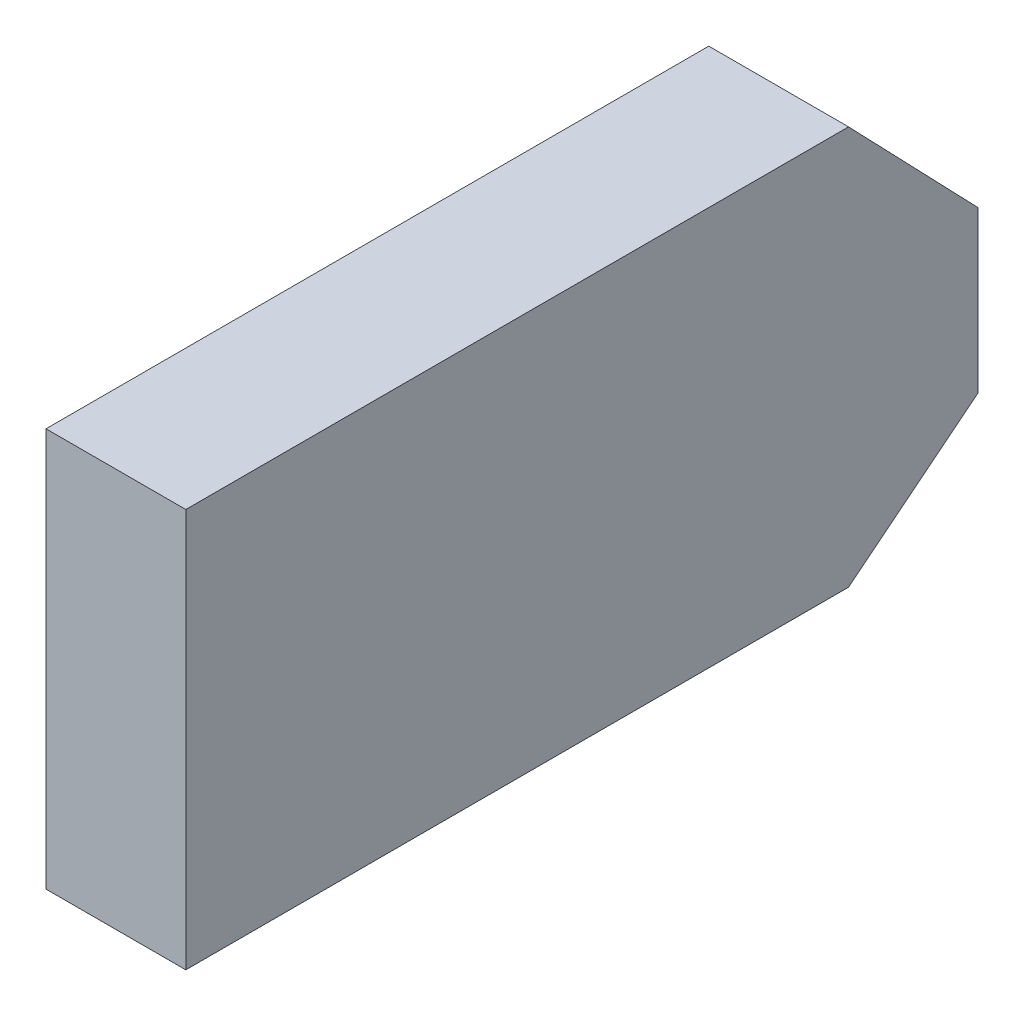
ISO-10303-21;
HEADER;
FILE_DESCRIPTION(('STEP AP214'),'2;1');
FILE_NAME('part.step','',(''),(''),'','','');
FILE_SCHEMA(('AUTOMOTIVE_DESIGN { 1 0 10303 214 1 1 1 1 }'));
ENDSEC;
DATA;
#1=APPLICATION_CONTEXT('core data for automotive mechanical design processes');
#2=APPLICATION_PROTOCOL_DEFINITION('international standard','automotive_design',2000,#1);
#3=PRODUCT_CONTEXT('',#1,'mechanical');
#4=PRODUCT('Part','Part','',(#3));
#5=PRODUCT_RELATED_PRODUCT_CATEGORY('part','',(#4));
#6=PRODUCT_DEFINITION_FORMATION('','',#4);
#7=PRODUCT_DEFINITION_CONTEXT('part definition',#1,'design');
#8=PRODUCT_DEFINITION('design','',#6,#7);
#9=PRODUCT_DEFINITION_SHAPE('','',#8);
#10=(LENGTH_UNIT() NAMED_UNIT(*) SI_UNIT(.MILLI.,.METRE.));
#11=(NAMED_UNIT(*) PLANE_ANGLE_UNIT() SI_UNIT($,.RADIAN.));
#12=(NAMED_UNIT(*) SI_UNIT($,.STERADIAN.) SOLID_ANGLE_UNIT());
#13=UNCERTAINTY_MEASURE_WITH_UNIT(LENGTH_MEASURE(1.E-05),#10,'distance_accuracy_value','');
#14=(GEOMETRIC_REPRESENTATION_CONTEXT(3) GLOBAL_UNCERTAINTY_ASSIGNED_CONTEXT((#13)) GLOBAL_UNIT_ASSIGNED_CONTEXT((#10,
#11,#12)) REPRESENTATION_CONTEXT('',''));
#15=CARTESIAN_POINT('',(0.,0.,0.));
#16=DIRECTION('',(0.,0.,1.));
#17=DIRECTION('',(1.,0.,0.));
#18=AXIS2_PLACEMENT_3D('',#15,#16,#17);
#19=CARTESIAN_POINT('',(27.,0.,-128.));
#20=DIRECTION('',(0.,1.,0.));
#21=DIRECTION('',(0.,0.,1.));
#22=AXIS2_PLACEMENT_3D('',#19,#20,#21);
#23=PLANE('',#22);
#24=DIRECTION('',(0.,0.,-1.));
#25=VECTOR('',#24,1.);
#26=CARTESIAN_POINT('',(0.,0.,-128.));
#27=LINE('',#26,#25);
#28=CARTESIAN_POINT('',(0.,0.,0.));
#29=VERTEX_POINT('',#28);
#30=CARTESIAN_POINT('',(0.,0.,-128.));
#31=VERTEX_POINT('',#30);
#32=EDGE_CURVE('E127',#29,#31,#27,.T.);
#33=ORIENTED_EDGE('',*,*,#32,.T.);
#34=DIRECTION('',(-1.,0.,0.));
#35=VECTOR('',#34,1.);
#36=CARTESIAN_POINT('',(27.,0.,-128.));
#37=LINE('',#36,#35);
#38=CARTESIAN_POINT('',(27.,0.,-128.));
#39=VERTEX_POINT('',#38);
#40=EDGE_CURVE('E11',#39,#31,#37,.T.);
#41=ORIENTED_EDGE('',*,*,#40,.F.);
#42=DIRECTION('',(0.,0.,-1.));
#43=VECTOR('',#42,1.);
#44=CARTESIAN_POINT('',(27.,0.,-128.));
#45=LINE('',#44,#43);
#46=CARTESIAN_POINT('',(27.,0.,0.));
#47=VERTEX_POINT('',#46);
#48=EDGE_CURVE('E143',#47,#39,#45,.T.);
#49=ORIENTED_EDGE('',*,*,#48,.F.);
#50=DIRECTION('',(-1.,0.,0.));
#51=VECTOR('',#50,1.);
#52=CARTESIAN_POINT('',(27.,0.,0.));
#53=LINE('',#52,#51);
#54=EDGE_CURVE('E123',#47,#29,#53,.T.);
#55=ORIENTED_EDGE('',*,*,#54,.T.);
#56=EDGE_LOOP('',(#33,#41,#49,#55));
#57=FACE_BOUND('',#56,.T.);
#58=ADVANCED_FACE('F38',(#57),#23,.F.);
#59=CARTESIAN_POINT('',(27.,20.,-153.));
#60=DIRECTION('',(0.,0.78086880944303,0.624695047554425));
#61=DIRECTION('',(0.,-0.624695047554425,0.78086880944303));
#62=AXIS2_PLACEMENT_3D('',#59,#60,#61);
#63=PLANE('',#62);
#64=DIRECTION('',(0.,0.624695047554424,-0.78086880944303));
#65=VECTOR('',#64,1.);
#66=CARTESIAN_POINT('',(0.,20.,-153.));
#67=LINE('',#66,#65);
#68=CARTESIAN_POINT('',(0.,20.,-153.));
#69=VERTEX_POINT('',#68);
#70=EDGE_CURVE('E131',#31,#69,#67,.T.);
#71=ORIENTED_EDGE('',*,*,#70,.T.);
#72=DIRECTION('',(-1.,0.,0.));
#73=VECTOR('',#72,1.);
#74=CARTESIAN_POINT('',(27.,20.,-153.));
#75=LINE('',#74,#73);
#76=CARTESIAN_POINT('',(27.,20.,-153.));
#77=VERTEX_POINT('',#76);
#78=EDGE_CURVE('E47',#77,#69,#75,.T.);
#79=ORIENTED_EDGE('',*,*,#78,.F.);
#80=DIRECTION('',(0.,0.624695047554424,-0.78086880944303));
#81=VECTOR('',#80,1.);
#82=CARTESIAN_POINT('',(27.,20.,-153.));
#83=LINE('',#82,#81);
#84=EDGE_CURVE('E92',#39,#77,#83,.T.);
#85=ORIENTED_EDGE('',*,*,#84,.F.);
#86=ORIENTED_EDGE('',*,*,#40,.T.);
#87=EDGE_LOOP('',(#71,#79,#85,#86));
#88=FACE_BOUND('',#87,.T.);
#89=ADVANCED_FACE('F171',(#88),#63,.F.);
#90=CARTESIAN_POINT('',(27.,51.,-153.));
#91=DIRECTION('',(0.,0.,1.));
#92=DIRECTION('',(1.,0.,0.));
#93=AXIS2_PLACEMENT_3D('',#90,#91,#92);
#94=PLANE('',#93);
#95=DIRECTION('',(0.,1.,0.));
#96=VECTOR('',#95,1.);
#97=CARTESIAN_POINT('',(0.,51.,-153.));
#98=LINE('',#97,#96);
#99=CARTESIAN_POINT('',(0.,51.,-153.));
#100=VERTEX_POINT('',#99);
#101=EDGE_CURVE('E134',#69,#100,#98,.T.);
#102=ORIENTED_EDGE('',*,*,#101,.T.);
#103=DIRECTION('',(-1.,0.,0.));
#104=VECTOR('',#103,1.);
#105=CARTESIAN_POINT('',(27.,51.,-153.));
#106=LINE('',#105,#104);
#107=CARTESIAN_POINT('',(27.,51.,-153.));
#108=VERTEX_POINT('',#107);
#109=EDGE_CURVE('E116',#108,#100,#106,.T.);
#110=ORIENTED_EDGE('',*,*,#109,.F.);
#111=DIRECTION('',(0.,1.,0.));
#112=VECTOR('',#111,1.);
#113=CARTESIAN_POINT('',(27.,51.,-153.));
#114=LINE('',#113,#112);
#115=EDGE_CURVE('E105',#77,#108,#114,.T.);
#116=ORIENTED_EDGE('',*,*,#115,.F.);
#117=ORIENTED_EDGE('',*,*,#78,.T.);
#118=EDGE_LOOP('',(#102,#110,#116,#117));
#119=FACE_BOUND('',#118,.T.);
#120=ADVANCED_FACE('F153',(#119),#94,.F.);
#121=CARTESIAN_POINT('',(27.,77.,-128.));
#122=DIRECTION('',(0.,-0.693108716251784,0.720833064901856));
#123=DIRECTION('',(0.,-0.720833064901856,-0.693108716251784));
#124=AXIS2_PLACEMENT_3D('',#121,#122,#123);
#125=PLANE('',#124);
#126=DIRECTION('',(0.,0.720833064901856,0.693108716251784));
#127=VECTOR('',#126,1.);
#128=CARTESIAN_POINT('',(0.,77.,-128.));
#129=LINE('',#128,#127);
#130=CARTESIAN_POINT('',(0.,77.,-128.));
#131=VERTEX_POINT('',#130);
#132=EDGE_CURVE('E114',#100,#131,#129,.T.);
#133=ORIENTED_EDGE('',*,*,#132,.T.);
#134=DIRECTION('',(-1.,0.,0.));
#135=VECTOR('',#134,1.);
#136=CARTESIAN_POINT('',(27.,77.,-128.));
#137=LINE('',#136,#135);
#138=CARTESIAN_POINT('',(27.,77.,-128.));
#139=VERTEX_POINT('',#138);
#140=EDGE_CURVE('E111',#139,#131,#137,.T.);
#141=ORIENTED_EDGE('',*,*,#140,.F.);
#142=DIRECTION('',(0.,0.720833064901856,0.693108716251784));
#143=VECTOR('',#142,1.);
#144=CARTESIAN_POINT('',(27.,77.,-128.));
#145=LINE('',#144,#143);
#146=EDGE_CURVE('E99',#108,#139,#145,.T.);
#147=ORIENTED_EDGE('',*,*,#146,.F.);
#148=ORIENTED_EDGE('',*,*,#109,.T.);
#149=EDGE_LOOP('',(#133,#141,#147,#148));
#150=FACE_BOUND('',#149,.T.);
#151=ADVANCED_FACE('F112',(#150),#125,.F.);
#152=CARTESIAN_POINT('',(27.,77.,0.));
#153=DIRECTION('',(0.,-1.,0.));
#154=DIRECTION('',(0.,0.,-1.));
#155=AXIS2_PLACEMENT_3D('',#152,#153,#154);
#156=PLANE('',#155);
#157=DIRECTION('',(0.,0.,1.));
#158=VECTOR('',#157,1.);
#159=CARTESIAN_POINT('',(0.,77.,0.));
#160=LINE('',#159,#158);
#161=CARTESIAN_POINT('',(0.,77.,0.));
#162=VERTEX_POINT('',#161);
#163=EDGE_CURVE('E78',#131,#162,#160,.T.);
#164=ORIENTED_EDGE('',*,*,#163,.T.);
#165=DIRECTION('',(-1.,0.,0.));
#166=VECTOR('',#165,1.);
#167=CARTESIAN_POINT('',(27.,77.,0.));
#168=LINE('',#167,#166);
#169=CARTESIAN_POINT('',(27.,77.,0.));
#170=VERTEX_POINT('',#169);
#171=EDGE_CURVE('E117',#170,#162,#168,.T.);
#172=ORIENTED_EDGE('',*,*,#171,.F.);
#173=DIRECTION('',(0.,0.,1.));
#174=VECTOR('',#173,1.);
#175=CARTESIAN_POINT('',(27.,77.,0.));
#176=LINE('',#175,#174);
#177=EDGE_CURVE('E103',#139,#170,#176,.T.);
#178=ORIENTED_EDGE('',*,*,#177,.F.);
#179=ORIENTED_EDGE('',*,*,#140,.T.);
#180=EDGE_LOOP('',(#164,#172,#178,#179));
#181=FACE_BOUND('',#180,.T.);
#182=ADVANCED_FACE('F119',(#181),#156,.F.);
#183=CARTESIAN_POINT('',(27.,0.,0.));
#184=DIRECTION('',(0.,0.,-1.));
#185=DIRECTION('',(-1.,0.,0.));
#186=AXIS2_PLACEMENT_3D('',#183,#184,#185);
#187=PLANE('',#186);
#188=DIRECTION('',(0.,-1.,0.));
#189=VECTOR('',#188,1.);
#190=CARTESIAN_POINT('',(0.,0.,0.));
#191=LINE('',#190,#189);
#192=EDGE_CURVE('E84',#162,#29,#191,.T.);
#193=ORIENTED_EDGE('',*,*,#192,.T.);
#194=ORIENTED_EDGE('',*,*,#54,.F.);
#195=DIRECTION('',(0.,-1.,0.));
#196=VECTOR('',#195,1.);
#197=CARTESIAN_POINT('',(27.,0.,0.));
#198=LINE('',#197,#196);
#199=EDGE_CURVE('E55',#170,#47,#198,.T.);
#200=ORIENTED_EDGE('',*,*,#199,.F.);
#201=ORIENTED_EDGE('',*,*,#171,.T.);
#202=EDGE_LOOP('',(#193,#194,#200,#201));
#203=FACE_BOUND('',#202,.T.);
#204=ADVANCED_FACE('F160',(#203),#187,.F.);
#205=CARTESIAN_POINT('',(27.,0.,0.));
#206=DIRECTION('',(-1.,0.,0.));
#207=DIRECTION('',(0.,0.,1.));
#208=AXIS2_PLACEMENT_3D('',#205,#206,#207);
#209=PLANE('',#208);
#210=ORIENTED_EDGE('',*,*,#48,.T.);
#211=ORIENTED_EDGE('',*,*,#84,.T.);
#212=ORIENTED_EDGE('',*,*,#115,.T.);
#213=ORIENTED_EDGE('',*,*,#146,.T.);
#214=ORIENTED_EDGE('',*,*,#177,.T.);
#215=ORIENTED_EDGE('',*,*,#199,.T.);
#216=EDGE_LOOP('',(#210,#211,#212,#213,#214,#215));
#217=FACE_BOUND('',#216,.T.);
#218=ADVANCED_FACE('F101',(#217),#209,.F.);
#219=CARTESIAN_POINT('',(0.,0.,0.));
#220=DIRECTION('',(-1.,0.,0.));
#221=DIRECTION('',(0.,0.,1.));
#222=AXIS2_PLACEMENT_3D('',#219,#220,#221);
#223=PLANE('',#222);
#224=ORIENTED_EDGE('',*,*,#32,.F.);
#225=ORIENTED_EDGE('',*,*,#192,.F.);
#226=ORIENTED_EDGE('',*,*,#163,.F.);
#227=ORIENTED_EDGE('',*,*,#132,.F.);
#228=ORIENTED_EDGE('',*,*,#101,.F.);
#229=ORIENTED_EDGE('',*,*,#70,.F.);
#230=EDGE_LOOP('',(#224,#225,#226,#227,#228,#229));
#231=FACE_BOUND('',#230,.T.);
#232=ADVANCED_FACE('F156',(#231),#223,.T.);
#233=CLOSED_SHELL('',(#58,#89,#120,#151,#182,#204,#218,#232));
#234=MANIFOLD_SOLID_BREP('B2',#233);
#235=ADVANCED_BREP_SHAPE_REPRESENTATION('',(#18,#234),#14);
#236=SHAPE_DEFINITION_REPRESENTATION(#9,#235);
ENDSEC;
END-ISO-10303-21;
